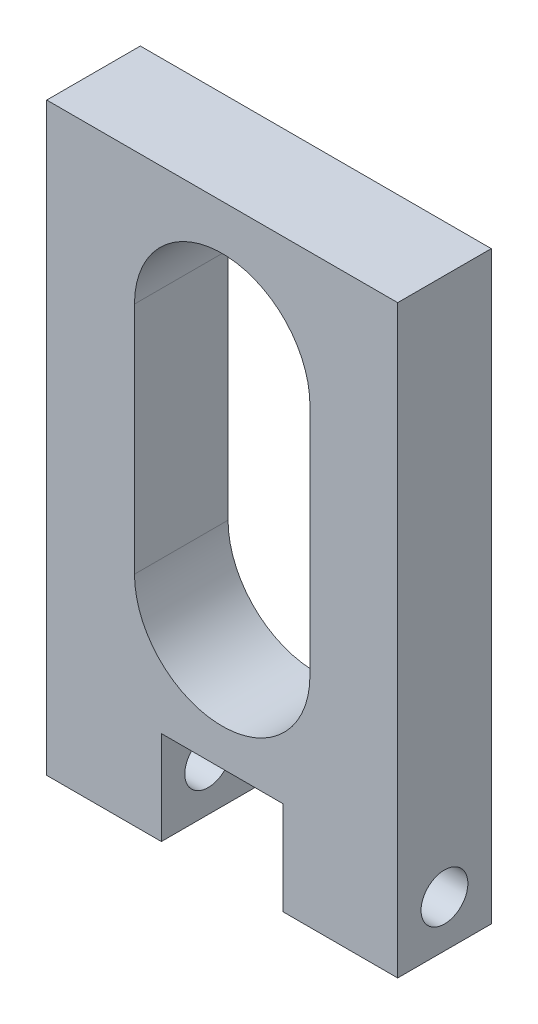
ISO-10303-21;
HEADER;
FILE_DESCRIPTION(('STEP AP214'),'2;1');
FILE_NAME('part.step','',(''),(''),'','','');
FILE_SCHEMA(('AUTOMOTIVE_DESIGN { 1 0 10303 214 1 1 1 1 }'));
ENDSEC;
DATA;
#1=APPLICATION_CONTEXT('core data for automotive mechanical design processes');
#2=APPLICATION_PROTOCOL_DEFINITION('international standard','automotive_design',2000,#1);
#3=PRODUCT_CONTEXT('',#1,'mechanical');
#4=PRODUCT('Part','Part','',(#3));
#5=PRODUCT_RELATED_PRODUCT_CATEGORY('part','',(#4));
#6=PRODUCT_DEFINITION_FORMATION('','',#4);
#7=PRODUCT_DEFINITION_CONTEXT('part definition',#1,'design');
#8=PRODUCT_DEFINITION('design','',#6,#7);
#9=PRODUCT_DEFINITION_SHAPE('','',#8);
#10=(LENGTH_UNIT() NAMED_UNIT(*) SI_UNIT(.MILLI.,.METRE.));
#11=(NAMED_UNIT(*) PLANE_ANGLE_UNIT() SI_UNIT($,.RADIAN.));
#12=(NAMED_UNIT(*) SI_UNIT($,.STERADIAN.) SOLID_ANGLE_UNIT());
#13=UNCERTAINTY_MEASURE_WITH_UNIT(LENGTH_MEASURE(1.E-05),#10,'distance_accuracy_value','');
#14=(GEOMETRIC_REPRESENTATION_CONTEXT(3) GLOBAL_UNCERTAINTY_ASSIGNED_CONTEXT((#13)) GLOBAL_UNIT_ASSIGNED_CONTEXT((#10,
#11,#12)) REPRESENTATION_CONTEXT('',''));
#15=CARTESIAN_POINT('',(0.,0.,0.));
#16=DIRECTION('',(0.,0.,1.));
#17=DIRECTION('',(1.,0.,0.));
#18=AXIS2_PLACEMENT_3D('',#15,#16,#17);
#19=CARTESIAN_POINT('',(0.,0.,10.16));
#20=DIRECTION('',(0.,0.,-1.));
#21=DIRECTION('',(-1.,0.,0.));
#22=AXIS2_PLACEMENT_3D('',#19,#20,#21);
#23=PLANE('',#22);
#24=DIRECTION('',(0.,-1.,0.));
#25=VECTOR('',#24,1.);
#26=CARTESIAN_POINT('',(0.,0.,10.16));
#27=LINE('',#26,#25);
#28=CARTESIAN_POINT('',(0.,63.5,10.16));
#29=VERTEX_POINT('',#28);
#30=CARTESIAN_POINT('',(0.,0.,10.16));
#31=VERTEX_POINT('',#30);
#32=EDGE_CURVE('E160',#29,#31,#27,.T.);
#33=ORIENTED_EDGE('',*,*,#32,.T.);
#34=DIRECTION('',(1.,0.,0.));
#35=VECTOR('',#34,1.);
#36=CARTESIAN_POINT('',(0.,0.,10.16));
#37=LINE('',#36,#35);
#38=CARTESIAN_POINT('',(12.446,0.,10.16));
#39=VERTEX_POINT('',#38);
#40=EDGE_CURVE('E163',#31,#39,#37,.T.);
#41=ORIENTED_EDGE('',*,*,#40,.T.);
#42=DIRECTION('',(0.,1.,0.));
#43=VECTOR('',#42,1.);
#44=CARTESIAN_POINT('',(12.446,0.,10.16));
#45=LINE('',#44,#43);
#46=CARTESIAN_POINT('',(12.446,10.16,10.16));
#47=VERTEX_POINT('',#46);
#48=EDGE_CURVE('E166',#39,#47,#45,.T.);
#49=ORIENTED_EDGE('',*,*,#48,.T.);
#50=DIRECTION('',(1.,0.,0.));
#51=VECTOR('',#50,1.);
#52=CARTESIAN_POINT('',(12.446,10.16,10.16));
#53=LINE('',#52,#51);
#54=CARTESIAN_POINT('',(25.654,10.16,10.16));
#55=VERTEX_POINT('',#54);
#56=EDGE_CURVE('E168',#47,#55,#53,.T.);
#57=ORIENTED_EDGE('',*,*,#56,.T.);
#58=DIRECTION('',(0.,-1.,0.));
#59=VECTOR('',#58,1.);
#60=CARTESIAN_POINT('',(25.654,10.16,10.16));
#61=LINE('',#60,#59);
#62=CARTESIAN_POINT('',(25.654,0.,10.16));
#63=VERTEX_POINT('',#62);
#64=EDGE_CURVE('E170',#55,#63,#61,.T.);
#65=ORIENTED_EDGE('',*,*,#64,.T.);
#66=DIRECTION('',(1.,0.,0.));
#67=VECTOR('',#66,1.);
#68=CARTESIAN_POINT('',(25.654,0.,10.16));
#69=LINE('',#68,#67);
#70=CARTESIAN_POINT('',(38.1,0.,10.16));
#71=VERTEX_POINT('',#70);
#72=EDGE_CURVE('E172',#63,#71,#69,.T.);
#73=ORIENTED_EDGE('',*,*,#72,.T.);
#74=DIRECTION('',(0.,1.,0.));
#75=VECTOR('',#74,1.);
#76=CARTESIAN_POINT('',(38.1,0.,10.16));
#77=LINE('',#76,#75);
#78=CARTESIAN_POINT('',(38.1,63.5,10.16));
#79=VERTEX_POINT('',#78);
#80=EDGE_CURVE('E174',#71,#79,#77,.T.);
#81=ORIENTED_EDGE('',*,*,#80,.T.);
#82=DIRECTION('',(-1.,0.,0.));
#83=VECTOR('',#82,1.);
#84=CARTESIAN_POINT('',(0.,63.5,10.16));
#85=LINE('',#84,#83);
#86=EDGE_CURVE('E176',#79,#29,#85,.T.);
#87=ORIENTED_EDGE('',*,*,#86,.T.);
#88=EDGE_LOOP('',(#33,#41,#49,#57,#65,#73,#81,#87));
#89=FACE_BOUND('',#88,.T.);
#90=CARTESIAN_POINT('',(19.05,49.0784560977248,10.16));
#91=DIRECTION('',(0.,0.,1.));
#92=DIRECTION('',(-1.,0.,0.));
#93=AXIS2_PLACEMENT_3D('',#90,#91,#92);
#94=CIRCLE('',#93,9.525);
#95=CARTESIAN_POINT('',(28.575,49.0784560977248,10.16));
#96=VERTEX_POINT('',#95);
#97=CARTESIAN_POINT('',(9.52500000000001,49.0784560977248,10.16));
#98=VERTEX_POINT('',#97);
#99=EDGE_CURVE('E122',#96,#98,#94,.T.);
#100=ORIENTED_EDGE('',*,*,#99,.F.);
#101=DIRECTION('',(0.,1.,0.));
#102=VECTOR('',#101,1.);
#103=CARTESIAN_POINT('',(28.575,49.0784560977248,10.16));
#104=LINE('',#103,#102);
#105=CARTESIAN_POINT('',(28.575,23.6784560977248,10.16));
#106=VERTEX_POINT('',#105);
#107=EDGE_CURVE('E144',#106,#96,#104,.T.);
#108=ORIENTED_EDGE('',*,*,#107,.F.);
#109=CARTESIAN_POINT('',(19.05,23.6784560977248,10.16));
#110=DIRECTION('',(0.,0.,1.));
#111=DIRECTION('',(1.,0.,0.));
#112=AXIS2_PLACEMENT_3D('',#109,#110,#111);
#113=CIRCLE('',#112,9.525);
#114=CARTESIAN_POINT('',(9.525,23.6784560977248,10.16));
#115=VERTEX_POINT('',#114);
#116=EDGE_CURVE('E142',#115,#106,#113,.T.);
#117=ORIENTED_EDGE('',*,*,#116,.F.);
#118=DIRECTION('',(0.,-1.,0.));
#119=VECTOR('',#118,1.);
#120=CARTESIAN_POINT('',(9.52500000000001,49.0784560977248,10.16));
#121=LINE('',#120,#119);
#122=EDGE_CURVE('E130',#98,#115,#121,.T.);
#123=ORIENTED_EDGE('',*,*,#122,.F.);
#124=EDGE_LOOP('',(#100,#108,#117,#123));
#125=FACE_BOUND('',#124,.T.);
#126=ADVANCED_FACE('F33',(#89,#125),#23,.F.);
#127=CARTESIAN_POINT('',(0.,0.,0.));
#128=DIRECTION('',(0.,0.,-1.));
#129=DIRECTION('',(-1.,0.,0.));
#130=AXIS2_PLACEMENT_3D('',#127,#128,#129);
#131=PLANE('',#130);
#132=DIRECTION('',(0.,-1.,0.));
#133=VECTOR('',#132,1.);
#134=CARTESIAN_POINT('',(0.,0.,0.));
#135=LINE('',#134,#133);
#136=CARTESIAN_POINT('',(0.,63.5,0.));
#137=VERTEX_POINT('',#136);
#138=CARTESIAN_POINT('',(0.,0.,0.));
#139=VERTEX_POINT('',#138);
#140=EDGE_CURVE('E138',#137,#139,#135,.T.);
#141=ORIENTED_EDGE('',*,*,#140,.F.);
#142=DIRECTION('',(-1.,0.,0.));
#143=VECTOR('',#142,1.);
#144=CARTESIAN_POINT('',(0.,63.5,0.));
#145=LINE('',#144,#143);
#146=CARTESIAN_POINT('',(38.1,63.5,0.));
#147=VERTEX_POINT('',#146);
#148=EDGE_CURVE('E164',#147,#137,#145,.T.);
#149=ORIENTED_EDGE('',*,*,#148,.F.);
#150=DIRECTION('',(0.,1.,0.));
#151=VECTOR('',#150,1.);
#152=CARTESIAN_POINT('',(38.1,0.,0.));
#153=LINE('',#152,#151);
#154=CARTESIAN_POINT('',(38.1,0.,0.));
#155=VERTEX_POINT('',#154);
#156=EDGE_CURVE('E191',#155,#147,#153,.T.);
#157=ORIENTED_EDGE('',*,*,#156,.F.);
#158=DIRECTION('',(1.,0.,0.));
#159=VECTOR('',#158,1.);
#160=CARTESIAN_POINT('',(25.654,0.,0.));
#161=LINE('',#160,#159);
#162=CARTESIAN_POINT('',(25.654,0.,0.));
#163=VERTEX_POINT('',#162);
#164=EDGE_CURVE('E189',#163,#155,#161,.T.);
#165=ORIENTED_EDGE('',*,*,#164,.F.);
#166=DIRECTION('',(0.,-1.,0.));
#167=VECTOR('',#166,1.);
#168=CARTESIAN_POINT('',(25.654,10.16,0.));
#169=LINE('',#168,#167);
#170=CARTESIAN_POINT('',(25.654,10.16,0.));
#171=VERTEX_POINT('',#170);
#172=EDGE_CURVE('E187',#171,#163,#169,.T.);
#173=ORIENTED_EDGE('',*,*,#172,.F.);
#174=DIRECTION('',(1.,0.,0.));
#175=VECTOR('',#174,1.);
#176=CARTESIAN_POINT('',(12.446,10.16,0.));
#177=LINE('',#176,#175);
#178=CARTESIAN_POINT('',(12.446,10.16,0.));
#179=VERTEX_POINT('',#178);
#180=EDGE_CURVE('E185',#179,#171,#177,.T.);
#181=ORIENTED_EDGE('',*,*,#180,.F.);
#182=DIRECTION('',(0.,1.,0.));
#183=VECTOR('',#182,1.);
#184=CARTESIAN_POINT('',(12.446,0.,0.));
#185=LINE('',#184,#183);
#186=CARTESIAN_POINT('',(12.446,0.,0.));
#187=VERTEX_POINT('',#186);
#188=EDGE_CURVE('E183',#187,#179,#185,.T.);
#189=ORIENTED_EDGE('',*,*,#188,.F.);
#190=DIRECTION('',(1.,0.,0.));
#191=VECTOR('',#190,1.);
#192=CARTESIAN_POINT('',(0.,0.,0.));
#193=LINE('',#192,#191);
#194=EDGE_CURVE('E181',#139,#187,#193,.T.);
#195=ORIENTED_EDGE('',*,*,#194,.F.);
#196=EDGE_LOOP('',(#141,#149,#157,#165,#173,#181,#189,#195));
#197=FACE_BOUND('',#196,.T.);
#198=DIRECTION('',(0.,1.,0.));
#199=VECTOR('',#198,1.);
#200=CARTESIAN_POINT('',(28.575,49.0784560977248,0.));
#201=LINE('',#200,#199);
#202=CARTESIAN_POINT('',(28.575,23.6784560977248,0.));
#203=VERTEX_POINT('',#202);
#204=CARTESIAN_POINT('',(28.575,49.0784560977248,0.));
#205=VERTEX_POINT('',#204);
#206=EDGE_CURVE('E131',#203,#205,#201,.T.);
#207=ORIENTED_EDGE('',*,*,#206,.T.);
#208=CARTESIAN_POINT('',(19.05,49.0784560977248,0.));
#209=DIRECTION('',(0.,0.,1.));
#210=DIRECTION('',(-1.,0.,0.));
#211=AXIS2_PLACEMENT_3D('',#208,#209,#210);
#212=CIRCLE('',#211,9.525);
#213=CARTESIAN_POINT('',(9.52500000000001,49.0784560977248,0.));
#214=VERTEX_POINT('',#213);
#215=EDGE_CURVE('E56',#205,#214,#212,.T.);
#216=ORIENTED_EDGE('',*,*,#215,.T.);
#217=DIRECTION('',(0.,-1.,0.));
#218=VECTOR('',#217,1.);
#219=CARTESIAN_POINT('',(9.52500000000001,49.0784560977248,0.));
#220=LINE('',#219,#218);
#221=CARTESIAN_POINT('',(9.525,23.6784560977248,0.));
#222=VERTEX_POINT('',#221);
#223=EDGE_CURVE('E137',#214,#222,#220,.T.);
#224=ORIENTED_EDGE('',*,*,#223,.T.);
#225=CARTESIAN_POINT('',(19.05,23.6784560977248,0.));
#226=DIRECTION('',(0.,0.,1.));
#227=DIRECTION('',(1.,0.,0.));
#228=AXIS2_PLACEMENT_3D('',#225,#226,#227);
#229=CIRCLE('',#228,9.525);
#230=EDGE_CURVE('E152',#222,#203,#229,.T.);
#231=ORIENTED_EDGE('',*,*,#230,.T.);
#232=EDGE_LOOP('',(#207,#216,#224,#231));
#233=FACE_BOUND('',#232,.T.);
#234=ADVANCED_FACE('F221',(#197,#233),#131,.T.);
#235=CARTESIAN_POINT('',(0.,0.,10.16));
#236=DIRECTION('',(1.,0.,0.));
#237=DIRECTION('',(0.,0.,-1.));
#238=AXIS2_PLACEMENT_3D('',#235,#236,#237);
#239=PLANE('',#238);
#240=CARTESIAN_POINT('',(0.,5.08,5.08));
#241=DIRECTION('',(-1.,0.,0.));
#242=DIRECTION('',(0.,0.,1.));
#243=AXIS2_PLACEMENT_3D('',#240,#241,#242);
#244=CIRCLE('',#243,2.54);
#245=CARTESIAN_POINT('',(0.,5.08,7.62));
#246=VERTEX_POINT('',#245);
#247=EDGE_CURVE('E299',#246,#246,#244,.T.);
#248=ORIENTED_EDGE('',*,*,#247,.F.);
#249=EDGE_LOOP('',(#248));
#250=FACE_BOUND('',#249,.T.);
#251=ORIENTED_EDGE('',*,*,#140,.T.);
#252=DIRECTION('',(0.,0.,-1.));
#253=VECTOR('',#252,1.);
#254=CARTESIAN_POINT('',(0.,0.,10.16));
#255=LINE('',#254,#253);
#256=EDGE_CURVE('E11',#31,#139,#255,.T.);
#257=ORIENTED_EDGE('',*,*,#256,.F.);
#258=ORIENTED_EDGE('',*,*,#32,.F.);
#259=DIRECTION('',(0.,0.,-1.));
#260=VECTOR('',#259,1.);
#261=CARTESIAN_POINT('',(0.,63.5,10.16));
#262=LINE('',#261,#260);
#263=EDGE_CURVE('E178',#29,#137,#262,.T.);
#264=ORIENTED_EDGE('',*,*,#263,.T.);
#265=EDGE_LOOP('',(#251,#257,#258,#264));
#266=FACE_BOUND('',#265,.T.);
#267=ADVANCED_FACE('F35',(#250,#266),#239,.F.);
#268=CARTESIAN_POINT('',(0.,0.,10.16));
#269=DIRECTION('',(0.,1.,0.));
#270=DIRECTION('',(0.,0.,1.));
#271=AXIS2_PLACEMENT_3D('',#268,#269,#270);
#272=PLANE('',#271);
#273=ORIENTED_EDGE('',*,*,#194,.T.);
#274=DIRECTION('',(0.,0.,-1.));
#275=VECTOR('',#274,1.);
#276=CARTESIAN_POINT('',(12.446,0.,10.16));
#277=LINE('',#276,#275);
#278=EDGE_CURVE('E41',#39,#187,#277,.T.);
#279=ORIENTED_EDGE('',*,*,#278,.F.);
#280=ORIENTED_EDGE('',*,*,#40,.F.);
#281=ORIENTED_EDGE('',*,*,#256,.T.);
#282=EDGE_LOOP('',(#273,#279,#280,#281));
#283=FACE_BOUND('',#282,.T.);
#284=ADVANCED_FACE('F238',(#283),#272,.F.);
#285=CARTESIAN_POINT('',(12.446,0.,10.16));
#286=DIRECTION('',(-1.,0.,0.));
#287=DIRECTION('',(0.,0.,1.));
#288=AXIS2_PLACEMENT_3D('',#285,#286,#287);
#289=PLANE('',#288);
#290=CARTESIAN_POINT('',(12.446,5.08,5.08));
#291=DIRECTION('',(-1.,0.,0.));
#292=DIRECTION('',(0.,0.,1.));
#293=AXIS2_PLACEMENT_3D('',#290,#291,#292);
#294=CIRCLE('',#293,2.54);
#295=CARTESIAN_POINT('',(12.446,5.08,7.62));
#296=VERTEX_POINT('',#295);
#297=EDGE_CURVE('E150',#296,#296,#294,.T.);
#298=ORIENTED_EDGE('',*,*,#297,.T.);
#299=EDGE_LOOP('',(#298));
#300=FACE_BOUND('',#299,.T.);
#301=ORIENTED_EDGE('',*,*,#188,.T.);
#302=DIRECTION('',(0.,0.,-1.));
#303=VECTOR('',#302,1.);
#304=CARTESIAN_POINT('',(12.446,10.16,10.16));
#305=LINE('',#304,#303);
#306=EDGE_CURVE('E208',#47,#179,#305,.T.);
#307=ORIENTED_EDGE('',*,*,#306,.F.);
#308=ORIENTED_EDGE('',*,*,#48,.F.);
#309=ORIENTED_EDGE('',*,*,#278,.T.);
#310=EDGE_LOOP('',(#301,#307,#308,#309));
#311=FACE_BOUND('',#310,.T.);
#312=ADVANCED_FACE('F215',(#300,#311),#289,.F.);
#313=CARTESIAN_POINT('',(12.446,10.16,10.16));
#314=DIRECTION('',(0.,1.,0.));
#315=DIRECTION('',(0.,0.,1.));
#316=AXIS2_PLACEMENT_3D('',#313,#314,#315);
#317=PLANE('',#316);
#318=ORIENTED_EDGE('',*,*,#180,.T.);
#319=DIRECTION('',(0.,0.,-1.));
#320=VECTOR('',#319,1.);
#321=CARTESIAN_POINT('',(25.654,10.16,10.16));
#322=LINE('',#321,#320);
#323=EDGE_CURVE('E205',#55,#171,#322,.T.);
#324=ORIENTED_EDGE('',*,*,#323,.F.);
#325=ORIENTED_EDGE('',*,*,#56,.F.);
#326=ORIENTED_EDGE('',*,*,#306,.T.);
#327=EDGE_LOOP('',(#318,#324,#325,#326));
#328=FACE_BOUND('',#327,.T.);
#329=ADVANCED_FACE('F227',(#328),#317,.F.);
#330=CARTESIAN_POINT('',(25.654,10.16,10.16));
#331=DIRECTION('',(1.,0.,0.));
#332=DIRECTION('',(0.,0.,-1.));
#333=AXIS2_PLACEMENT_3D('',#330,#331,#332);
#334=PLANE('',#333);
#335=CARTESIAN_POINT('',(25.654,5.08,5.08));
#336=DIRECTION('',(1.,0.,0.));
#337=DIRECTION('',(0.,0.,-1.));
#338=AXIS2_PLACEMENT_3D('',#335,#336,#337);
#339=CIRCLE('',#338,2.54);
#340=CARTESIAN_POINT('',(25.654,5.08,7.62));
#341=VERTEX_POINT('',#340);
#342=EDGE_CURVE('E303',#341,#341,#339,.T.);
#343=ORIENTED_EDGE('',*,*,#342,.T.);
#344=EDGE_LOOP('',(#343));
#345=FACE_BOUND('',#344,.T.);
#346=ORIENTED_EDGE('',*,*,#172,.T.);
#347=DIRECTION('',(0.,0.,-1.));
#348=VECTOR('',#347,1.);
#349=CARTESIAN_POINT('',(25.654,0.,10.16));
#350=LINE('',#349,#348);
#351=EDGE_CURVE('E202',#63,#163,#350,.T.);
#352=ORIENTED_EDGE('',*,*,#351,.F.);
#353=ORIENTED_EDGE('',*,*,#64,.F.);
#354=ORIENTED_EDGE('',*,*,#323,.T.);
#355=EDGE_LOOP('',(#346,#352,#353,#354));
#356=FACE_BOUND('',#355,.T.);
#357=ADVANCED_FACE('F231',(#345,#356),#334,.F.);
#358=CARTESIAN_POINT('',(25.654,0.,10.16));
#359=DIRECTION('',(0.,1.,0.));
#360=DIRECTION('',(0.,0.,1.));
#361=AXIS2_PLACEMENT_3D('',#358,#359,#360);
#362=PLANE('',#361);
#363=ORIENTED_EDGE('',*,*,#164,.T.);
#364=DIRECTION('',(0.,0.,-1.));
#365=VECTOR('',#364,1.);
#366=CARTESIAN_POINT('',(38.1,0.,10.16));
#367=LINE('',#366,#365);
#368=EDGE_CURVE('E199',#71,#155,#367,.T.);
#369=ORIENTED_EDGE('',*,*,#368,.F.);
#370=ORIENTED_EDGE('',*,*,#72,.F.);
#371=ORIENTED_EDGE('',*,*,#351,.T.);
#372=EDGE_LOOP('',(#363,#369,#370,#371));
#373=FACE_BOUND('',#372,.T.);
#374=ADVANCED_FACE('F251',(#373),#362,.F.);
#375=CARTESIAN_POINT('',(38.1,0.,10.16));
#376=DIRECTION('',(-1.,0.,0.));
#377=DIRECTION('',(0.,-1.,0.));
#378=AXIS2_PLACEMENT_3D('',#375,#376,#377);
#379=PLANE('',#378);
#380=CARTESIAN_POINT('',(38.1,5.08,5.08));
#381=DIRECTION('',(-1.,0.,0.));
#382=DIRECTION('',(0.,0.,1.));
#383=AXIS2_PLACEMENT_3D('',#380,#381,#382);
#384=CIRCLE('',#383,2.54);
#385=CARTESIAN_POINT('',(38.1,5.08,7.62));
#386=VERTEX_POINT('',#385);
#387=EDGE_CURVE('E305',#386,#386,#384,.T.);
#388=ORIENTED_EDGE('',*,*,#387,.T.);
#389=EDGE_LOOP('',(#388));
#390=FACE_BOUND('',#389,.T.);
#391=ORIENTED_EDGE('',*,*,#156,.T.);
#392=DIRECTION('',(0.,0.,-1.));
#393=VECTOR('',#392,1.);
#394=CARTESIAN_POINT('',(38.1,63.5,10.16));
#395=LINE('',#394,#393);
#396=EDGE_CURVE('E196',#79,#147,#395,.T.);
#397=ORIENTED_EDGE('',*,*,#396,.F.);
#398=ORIENTED_EDGE('',*,*,#80,.F.);
#399=ORIENTED_EDGE('',*,*,#368,.T.);
#400=EDGE_LOOP('',(#391,#397,#398,#399));
#401=FACE_BOUND('',#400,.T.);
#402=ADVANCED_FACE('F249',(#390,#401),#379,.F.);
#403=CARTESIAN_POINT('',(0.,63.5,10.16));
#404=DIRECTION('',(0.,-1.,0.));
#405=DIRECTION('',(0.,0.,-1.));
#406=AXIS2_PLACEMENT_3D('',#403,#404,#405);
#407=PLANE('',#406);
#408=ORIENTED_EDGE('',*,*,#148,.T.);
#409=ORIENTED_EDGE('',*,*,#263,.F.);
#410=ORIENTED_EDGE('',*,*,#86,.F.);
#411=ORIENTED_EDGE('',*,*,#396,.T.);
#412=EDGE_LOOP('',(#408,#409,#410,#411));
#413=FACE_BOUND('',#412,.T.);
#414=ADVANCED_FACE('F244',(#413),#407,.F.);
#415=CARTESIAN_POINT('',(19.05,49.0784560977248,10.16));
#416=DIRECTION('',(0.,0.,-1.));
#417=DIRECTION('',(-1.,0.,0.));
#418=AXIS2_PLACEMENT_3D('',#415,#416,#417);
#419=CYLINDRICAL_SURFACE('',#418,9.525);
#420=ORIENTED_EDGE('',*,*,#215,.F.);
#421=DIRECTION('',(0.,0.,-1.));
#422=VECTOR('',#421,1.);
#423=CARTESIAN_POINT('',(28.575,49.0784560977248,10.16));
#424=LINE('',#423,#422);
#425=EDGE_CURVE('E126',#96,#205,#424,.T.);
#426=ORIENTED_EDGE('',*,*,#425,.F.);
#427=ORIENTED_EDGE('',*,*,#99,.T.);
#428=DIRECTION('',(0.,0.,-1.));
#429=VECTOR('',#428,1.);
#430=CARTESIAN_POINT('',(9.52500000000001,49.0784560977248,10.16));
#431=LINE('',#430,#429);
#432=EDGE_CURVE('E125',#98,#214,#431,.T.);
#433=ORIENTED_EDGE('',*,*,#432,.T.);
#434=EDGE_LOOP('',(#420,#426,#427,#433));
#435=FACE_BOUND('',#434,.T.);
#436=ADVANCED_FACE('F124',(#435),#419,.F.);
#437=CARTESIAN_POINT('',(9.52500000000001,49.0784560977248,10.16));
#438=DIRECTION('',(1.,0.,0.));
#439=DIRECTION('',(0.,1.,0.));
#440=AXIS2_PLACEMENT_3D('',#437,#438,#439);
#441=PLANE('',#440);
#442=ORIENTED_EDGE('',*,*,#223,.F.);
#443=ORIENTED_EDGE('',*,*,#432,.F.);
#444=ORIENTED_EDGE('',*,*,#122,.T.);
#445=DIRECTION('',(0.,0.,-1.));
#446=VECTOR('',#445,1.);
#447=CARTESIAN_POINT('',(9.525,23.6784560977248,10.16));
#448=LINE('',#447,#446);
#449=EDGE_CURVE('E139',#115,#222,#448,.T.);
#450=ORIENTED_EDGE('',*,*,#449,.T.);
#451=EDGE_LOOP('',(#442,#443,#444,#450));
#452=FACE_BOUND('',#451,.T.);
#453=ADVANCED_FACE('F134',(#452),#441,.T.);
#454=CARTESIAN_POINT('',(19.05,23.6784560977248,10.16));
#455=DIRECTION('',(0.,0.,-1.));
#456=DIRECTION('',(-1.,0.,0.));
#457=AXIS2_PLACEMENT_3D('',#454,#455,#456);
#458=CYLINDRICAL_SURFACE('',#457,9.525);
#459=ORIENTED_EDGE('',*,*,#230,.F.);
#460=ORIENTED_EDGE('',*,*,#449,.F.);
#461=ORIENTED_EDGE('',*,*,#116,.T.);
#462=DIRECTION('',(0.,0.,-1.));
#463=VECTOR('',#462,1.);
#464=CARTESIAN_POINT('',(28.575,23.6784560977248,10.16));
#465=LINE('',#464,#463);
#466=EDGE_CURVE('E48',#106,#203,#465,.T.);
#467=ORIENTED_EDGE('',*,*,#466,.T.);
#468=EDGE_LOOP('',(#459,#460,#461,#467));
#469=FACE_BOUND('',#468,.T.);
#470=ADVANCED_FACE('F278',(#469),#458,.F.);
#471=CARTESIAN_POINT('',(28.575,49.0784560977248,10.16));
#472=DIRECTION('',(-1.,0.,0.));
#473=DIRECTION('',(0.,-1.,0.));
#474=AXIS2_PLACEMENT_3D('',#471,#472,#473);
#475=PLANE('',#474);
#476=ORIENTED_EDGE('',*,*,#206,.F.);
#477=ORIENTED_EDGE('',*,*,#466,.F.);
#478=ORIENTED_EDGE('',*,*,#107,.T.);
#479=ORIENTED_EDGE('',*,*,#425,.T.);
#480=EDGE_LOOP('',(#476,#477,#478,#479));
#481=FACE_BOUND('',#480,.T.);
#482=ADVANCED_FACE('F282',(#481),#475,.T.);
#483=CARTESIAN_POINT('',(38.1,5.08,5.08));
#484=DIRECTION('',(-1.,0.,0.));
#485=DIRECTION('',(0.,0.,1.));
#486=AXIS2_PLACEMENT_3D('',#483,#484,#485);
#487=CYLINDRICAL_SURFACE('',#486,2.54);
#488=CARTESIAN_POINT('',(38.1,5.08,7.62));
#489=CARTESIAN_POINT('',(37.9703541666667,5.08,7.62));
#490=CARTESIAN_POINT('',(37.8407083333333,5.08,7.62));
#491=CARTESIAN_POINT('',(37.5814166666667,5.08,7.62));
#492=CARTESIAN_POINT('',(37.4517708333333,5.08,7.62));
#493=CARTESIAN_POINT('',(37.1924791666667,5.08,7.62));
#494=CARTESIAN_POINT('',(37.0628333333333,5.08,7.62));
#495=CARTESIAN_POINT('',(36.8035416666667,5.08,7.62));
#496=CARTESIAN_POINT('',(36.6738958333333,5.08,7.62));
#497=CARTESIAN_POINT('',(36.4146041666667,5.08,7.62));
#498=CARTESIAN_POINT('',(36.2849583333333,5.08,7.62));
#499=CARTESIAN_POINT('',(36.0256666666667,5.08,7.62));
#500=CARTESIAN_POINT('',(35.8960208333333,5.08,7.62));
#501=CARTESIAN_POINT('',(35.6367291666667,5.08,7.62));
#502=CARTESIAN_POINT('',(35.5070833333333,5.08,7.62));
#503=CARTESIAN_POINT('',(35.2477916666667,5.08,7.62));
#504=CARTESIAN_POINT('',(35.1181458333333,5.08,7.62));
#505=CARTESIAN_POINT('',(34.8588541666667,5.08,7.62));
#506=CARTESIAN_POINT('',(34.7292083333333,5.08,7.62));
#507=CARTESIAN_POINT('',(34.4699166666667,5.08,7.62));
#508=CARTESIAN_POINT('',(34.3402708333333,5.08,7.62));
#509=CARTESIAN_POINT('',(34.0809791666667,5.08,7.62));
#510=CARTESIAN_POINT('',(33.9513333333333,5.08,7.62));
#511=CARTESIAN_POINT('',(33.6920416666667,5.08,7.62));
#512=CARTESIAN_POINT('',(33.5623958333333,5.08,7.62));
#513=CARTESIAN_POINT('',(33.3031041666667,5.08,7.62));
#514=CARTESIAN_POINT('',(33.1734583333333,5.08,7.62));
#515=CARTESIAN_POINT('',(32.9141666666667,5.08,7.62));
#516=CARTESIAN_POINT('',(32.7845208333333,5.08,7.62));
#517=CARTESIAN_POINT('',(32.5252291666667,5.08,7.62));
#518=CARTESIAN_POINT('',(32.3955833333333,5.08,7.62));
#519=CARTESIAN_POINT('',(32.1362916666667,5.08,7.62));
#520=CARTESIAN_POINT('',(32.0066458333333,5.08,7.62));
#521=CARTESIAN_POINT('',(31.7473541666667,5.08,7.62));
#522=CARTESIAN_POINT('',(31.6177083333333,5.08,7.62));
#523=CARTESIAN_POINT('',(31.3584166666667,5.08,7.62));
#524=CARTESIAN_POINT('',(31.2287708333333,5.08,7.62));
#525=CARTESIAN_POINT('',(30.9694791666667,5.08,7.62));
#526=CARTESIAN_POINT('',(30.8398333333333,5.08,7.62));
#527=CARTESIAN_POINT('',(30.5805416666667,5.08,7.62));
#528=CARTESIAN_POINT('',(30.4508958333333,5.08,7.62));
#529=CARTESIAN_POINT('',(30.1916041666667,5.08,7.62));
#530=CARTESIAN_POINT('',(30.0619583333333,5.08,7.62));
#531=CARTESIAN_POINT('',(29.8026666666667,5.08,7.62));
#532=CARTESIAN_POINT('',(29.6730208333333,5.08,7.62));
#533=CARTESIAN_POINT('',(29.4137291666667,5.08,7.62));
#534=CARTESIAN_POINT('',(29.2840833333333,5.08,7.62));
#535=CARTESIAN_POINT('',(29.0247916666667,5.08,7.62));
#536=CARTESIAN_POINT('',(28.8951458333333,5.08,7.62));
#537=CARTESIAN_POINT('',(28.6358541666667,5.08,7.62));
#538=CARTESIAN_POINT('',(28.5062083333333,5.08,7.62));
#539=CARTESIAN_POINT('',(28.2469166666667,5.08,7.62));
#540=CARTESIAN_POINT('',(28.1172708333333,5.08,7.62));
#541=CARTESIAN_POINT('',(27.8579791666667,5.08,7.62));
#542=CARTESIAN_POINT('',(27.7283333333333,5.08,7.62));
#543=CARTESIAN_POINT('',(27.4690416666667,5.08,7.62));
#544=CARTESIAN_POINT('',(27.3393958333333,5.08,7.62));
#545=CARTESIAN_POINT('',(27.0801041666667,5.08,7.62));
#546=CARTESIAN_POINT('',(26.9504583333333,5.08,7.62));
#547=CARTESIAN_POINT('',(26.6911666666667,5.08,7.62));
#548=CARTESIAN_POINT('',(26.5615208333333,5.08,7.62));
#549=CARTESIAN_POINT('',(26.3022291666667,5.08,7.62));
#550=CARTESIAN_POINT('',(26.1725833333333,5.08,7.62));
#551=CARTESIAN_POINT('',(25.9132916666667,5.08,7.62));
#552=CARTESIAN_POINT('',(25.7836458333333,5.08,7.62));
#553=CARTESIAN_POINT('',(25.654,5.08,7.62));
#554=B_SPLINE_CURVE_WITH_KNOTS('',3,(#488,#489,#490,#491,#492,#493,#494,#495,#496,#497,#498,
#499,#500,#501,#502,#503,#504,#505,#506,#507,#508,#509,#510,#511,#512,#513,#514,#515,#516,#517,
#518,#519,#520,#521,#522,#523,#524,#525,#526,#527,#528,#529,#530,#531,#532,#533,#534,#535,#536,
#537,#538,#539,#540,#541,#542,#543,#544,#545,#546,#547,#548,#549,#550,#551,#552,#553),
.UNSPECIFIED.,.F.,.F.,(4,2,2,2,2,2,2,2,2,2,2,2,2,2,2,2,2,2,2,2,2,2,2,2,2,2,2,2,2,2,2,2,4),(0.,
0.388937500000006,0.777875000000004,1.1668125,1.55575,1.94468750000001,2.33362500000001,
2.7225625,3.1115,3.50043750000001,3.88937500000001,4.27831250000001,4.66725,5.0561875,
5.44512500000001,5.83406250000001,6.22300000000001,6.61193750000001,7.00087500000001,
7.38981250000001,7.77875000000001,8.16768750000001,8.55662500000001,8.94556250000001,
9.33450000000001,9.72343750000001,10.112375,10.5013125,10.89025,11.2791875,11.668125,12.0570625,
12.446),.UNSPECIFIED.);
#555=EDGE_CURVE('BSEAM288',#386,#341,#554,.T.);
#556=ORIENTED_EDGE('',*,*,#387,.F.);
#557=ORIENTED_EDGE('',*,*,#342,.F.);
#558=ORIENTED_EDGE('',*,*,#555,.T.);
#559=ORIENTED_EDGE('',*,*,#555,.F.);
#560=EDGE_LOOP('',(#556,#558,#557,#559));
#561=FACE_BOUND('',#560,.T.);
#562=ADVANCED_FACE('F288',(#561),#487,.F.);
#563=CARTESIAN_POINT('',(0.,5.08,7.62));
#564=CARTESIAN_POINT('',(0.129645833333333,5.08,7.62));
#565=CARTESIAN_POINT('',(0.259291666666666,5.08,7.62));
#566=CARTESIAN_POINT('',(0.518583333333332,5.08,7.62));
#567=CARTESIAN_POINT('',(0.648229166666664,5.08,7.62));
#568=CARTESIAN_POINT('',(0.907520833333332,5.08,7.62));
#569=CARTESIAN_POINT('',(1.03716666666667,5.08,7.62));
#570=CARTESIAN_POINT('',(1.29645833333334,5.08,7.62));
#571=CARTESIAN_POINT('',(1.42610416666667,5.08,7.62));
#572=CARTESIAN_POINT('',(1.68539583333333,5.08,7.62));
#573=CARTESIAN_POINT('',(1.81504166666667,5.08,7.62));
#574=CARTESIAN_POINT('',(2.07433333333333,5.08,7.62));
#575=CARTESIAN_POINT('',(2.20397916666667,5.08,7.62));
#576=CARTESIAN_POINT('',(2.46327083333333,5.08,7.62));
#577=CARTESIAN_POINT('',(2.59291666666666,5.08,7.62));
#578=CARTESIAN_POINT('',(2.85220833333333,5.08,7.62));
#579=CARTESIAN_POINT('',(2.98185416666667,5.08,7.62));
#580=CARTESIAN_POINT('',(3.24114583333334,5.08,7.62));
#581=CARTESIAN_POINT('',(3.37079166666667,5.08,7.62));
#582=CARTESIAN_POINT('',(3.63008333333333,5.08,7.62));
#583=CARTESIAN_POINT('',(3.75972916666667,5.08,7.62));
#584=CARTESIAN_POINT('',(4.01902083333333,5.08,7.62));
#585=CARTESIAN_POINT('',(4.14866666666667,5.08,7.62));
#586=CARTESIAN_POINT('',(4.40795833333333,5.08,7.62));
#587=CARTESIAN_POINT('',(4.53760416666667,5.08,7.62));
#588=CARTESIAN_POINT('',(4.79689583333334,5.08,7.62));
#589=CARTESIAN_POINT('',(4.92654166666667,5.08,7.62));
#590=CARTESIAN_POINT('',(5.18583333333334,5.08,7.62));
#591=CARTESIAN_POINT('',(5.31547916666667,5.08,7.62));
#592=CARTESIAN_POINT('',(5.57477083333333,5.08,7.62));
#593=CARTESIAN_POINT('',(5.70441666666667,5.08,7.62));
#594=CARTESIAN_POINT('',(5.96370833333334,5.08,7.62));
#595=CARTESIAN_POINT('',(6.09335416666667,5.08,7.62));
#596=CARTESIAN_POINT('',(6.35264583333334,5.08,7.62));
#597=CARTESIAN_POINT('',(6.48229166666667,5.08,7.62));
#598=CARTESIAN_POINT('',(6.74158333333334,5.08,7.62));
#599=CARTESIAN_POINT('',(6.87122916666667,5.08,7.62));
#600=CARTESIAN_POINT('',(7.13052083333333,5.08,7.62));
#601=CARTESIAN_POINT('',(7.26016666666667,5.08,7.62));
#602=CARTESIAN_POINT('',(7.51945833333333,5.08,7.62));
#603=CARTESIAN_POINT('',(7.64910416666667,5.08,7.62));
#604=CARTESIAN_POINT('',(7.90839583333333,5.08,7.62));
#605=CARTESIAN_POINT('',(8.03804166666667,5.08,7.62));
#606=CARTESIAN_POINT('',(8.29733333333333,5.08,7.62));
#607=CARTESIAN_POINT('',(8.42697916666667,5.08,7.62));
#608=CARTESIAN_POINT('',(8.68627083333333,5.08,7.62));
#609=CARTESIAN_POINT('',(8.81591666666667,5.08,7.62));
#610=CARTESIAN_POINT('',(9.07520833333333,5.08,7.62));
#611=CARTESIAN_POINT('',(9.20485416666667,5.08,7.62));
#612=CARTESIAN_POINT('',(9.46414583333333,5.08,7.62));
#613=CARTESIAN_POINT('',(9.59379166666667,5.08,7.62));
#614=CARTESIAN_POINT('',(9.85308333333334,5.08,7.62));
#615=CARTESIAN_POINT('',(9.98272916666667,5.08,7.62));
#616=CARTESIAN_POINT('',(10.2420208333333,5.08,7.62));
#617=CARTESIAN_POINT('',(10.3716666666667,5.08,7.62));
#618=CARTESIAN_POINT('',(10.6309583333333,5.08,7.62));
#619=CARTESIAN_POINT('',(10.7606041666667,5.08,7.62));
#620=CARTESIAN_POINT('',(11.0198958333333,5.08,7.62));
#621=CARTESIAN_POINT('',(11.1495416666667,5.08,7.62));
#622=CARTESIAN_POINT('',(11.4088333333333,5.08,7.62));
#623=CARTESIAN_POINT('',(11.5384791666667,5.08,7.62));
#624=CARTESIAN_POINT('',(11.7977708333333,5.08,7.62));
#625=CARTESIAN_POINT('',(11.9274166666667,5.08,7.62));
#626=CARTESIAN_POINT('',(12.1867083333333,5.08,7.62));
#627=CARTESIAN_POINT('',(12.3163541666667,5.08,7.62));
#628=CARTESIAN_POINT('',(12.446,5.08,7.62));
#629=B_SPLINE_CURVE_WITH_KNOTS('',3,(#563,#564,#565,#566,#567,#568,#569,#570,#571,#572,#573,
#574,#575,#576,#577,#578,#579,#580,#581,#582,#583,#584,#585,#586,#587,#588,#589,#590,#591,#592,
#593,#594,#595,#596,#597,#598,#599,#600,#601,#602,#603,#604,#605,#606,#607,#608,#609,#610,#611,
#612,#613,#614,#615,#616,#617,#618,#619,#620,#621,#622,#623,#624,#625,#626,#627,#628),
.UNSPECIFIED.,.F.,.F.,(4,2,2,2,2,2,2,2,2,2,2,2,2,2,2,2,2,2,2,2,2,2,2,2,2,2,2,2,2,2,2,2,4),(0.,
0.388937499999999,0.777874999999997,1.1668125,1.55575,1.9446875,2.333625,2.7225625,3.1115,
3.5004375,3.889375,4.2783125,4.66725,5.0561875,5.445125,5.8340625,6.22300000000001,
6.61193750000001,7.000875,7.3898125,7.77875,8.1676875,8.556625,8.9455625,9.3345,9.7234375,
10.112375,10.5013125,10.89025,11.2791875,11.668125,12.0570625,12.446),.UNSPECIFIED.);
#630=EDGE_CURVE('BSEAM289',#246,#296,#629,.T.);
#631=ORIENTED_EDGE('',*,*,#247,.T.);
#632=ORIENTED_EDGE('',*,*,#297,.F.);
#633=ORIENTED_EDGE('',*,*,#630,.T.);
#634=ORIENTED_EDGE('',*,*,#630,.F.);
#635=EDGE_LOOP('',(#631,#633,#632,#634));
#636=FACE_BOUND('',#635,.T.);
#637=ADVANCED_FACE('F289',(#636),#487,.F.);
#638=CLOSED_SHELL('',(#126,#234,#267,#284,#312,#329,#357,#374,#402,#414,#436,#453,#470,#482,
#562,#637));
#639=MANIFOLD_SOLID_BREP('B2',#638);
#640=ADVANCED_BREP_SHAPE_REPRESENTATION('',(#18,#639),#14);
#641=SHAPE_DEFINITION_REPRESENTATION(#9,#640);
ENDSEC;
END-ISO-10303-21;
